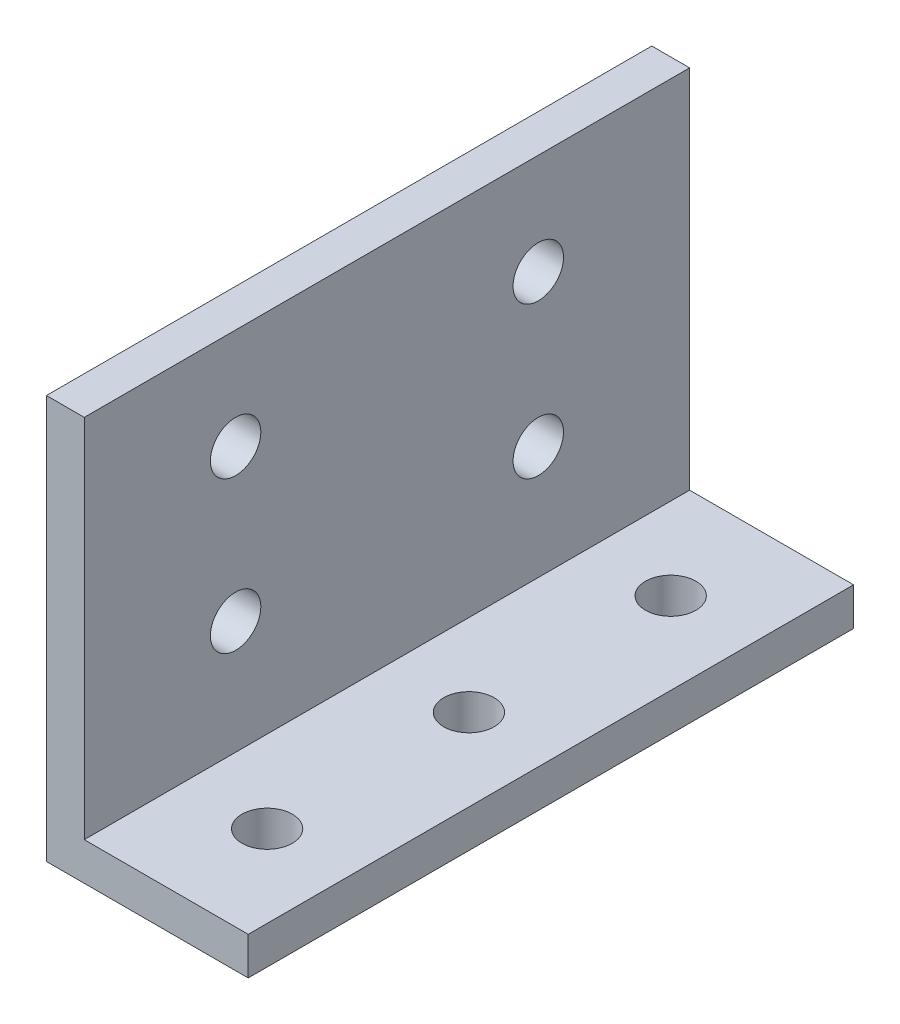
ISO-10303-21;
HEADER;
FILE_DESCRIPTION(('STEP AP214'),'2;1');
FILE_NAME('part.step','',(''),(''),'','','');
FILE_SCHEMA(('AUTOMOTIVE_DESIGN { 1 0 10303 214 1 1 1 1 }'));
ENDSEC;
DATA;
#1=APPLICATION_CONTEXT('core data for automotive mechanical design processes');
#2=APPLICATION_PROTOCOL_DEFINITION('international standard','automotive_design',2000,#1);
#3=PRODUCT_CONTEXT('',#1,'mechanical');
#4=PRODUCT('Part','Part','',(#3));
#5=PRODUCT_RELATED_PRODUCT_CATEGORY('part','',(#4));
#6=PRODUCT_DEFINITION_FORMATION('','',#4);
#7=PRODUCT_DEFINITION_CONTEXT('part definition',#1,'design');
#8=PRODUCT_DEFINITION('design','',#6,#7);
#9=PRODUCT_DEFINITION_SHAPE('','',#8);
#10=(LENGTH_UNIT() NAMED_UNIT(*) SI_UNIT(.MILLI.,.METRE.));
#11=(NAMED_UNIT(*) PLANE_ANGLE_UNIT() SI_UNIT($,.RADIAN.));
#12=(NAMED_UNIT(*) SI_UNIT($,.STERADIAN.) SOLID_ANGLE_UNIT());
#13=UNCERTAINTY_MEASURE_WITH_UNIT(LENGTH_MEASURE(1.E-05),#10,'distance_accuracy_value','');
#14=(GEOMETRIC_REPRESENTATION_CONTEXT(3) GLOBAL_UNCERTAINTY_ASSIGNED_CONTEXT((#13)) GLOBAL_UNIT_ASSIGNED_CONTEXT((#10,
#11,#12)) REPRESENTATION_CONTEXT('',''));
#15=CARTESIAN_POINT('',(0.,0.,0.));
#16=DIRECTION('',(0.,0.,1.));
#17=DIRECTION('',(1.,0.,0.));
#18=AXIS2_PLACEMENT_3D('',#15,#16,#17);
#19=CARTESIAN_POINT('',(0.,0.,76.2));
#20=DIRECTION('',(0.,-1.,0.));
#21=DIRECTION('',(0.,0.,-1.));
#22=AXIS2_PLACEMENT_3D('',#19,#20,#21);
#23=PLANE('',#22);
#24=CARTESIAN_POINT('',(10.31875,0.,38.1));
#25=DIRECTION('',(0.,1.,0.));
#26=DIRECTION('',(0.,0.,1.));
#27=AXIS2_PLACEMENT_3D('',#24,#25,#26);
#28=CIRCLE('',#27,3.175);
#29=CARTESIAN_POINT('',(10.31875,0.,41.275));
#30=VERTEX_POINT('',#29);
#31=EDGE_CURVE('E163',#30,#30,#28,.T.);
#32=ORIENTED_EDGE('',*,*,#31,.F.);
#33=EDGE_LOOP('',(#32));
#34=FACE_BOUND('',#33,.T.);
#35=CARTESIAN_POINT('',(10.31875,0.,63.5));
#36=DIRECTION('',(0.,1.,0.));
#37=DIRECTION('',(0.,0.,1.));
#38=AXIS2_PLACEMENT_3D('',#35,#36,#37);
#39=CIRCLE('',#38,3.175);
#40=CARTESIAN_POINT('',(10.31875,0.,66.675));
#41=VERTEX_POINT('',#40);
#42=EDGE_CURVE('E167',#41,#41,#39,.T.);
#43=ORIENTED_EDGE('',*,*,#42,.F.);
#44=EDGE_LOOP('',(#43));
#45=FACE_BOUND('',#44,.T.);
#46=CARTESIAN_POINT('',(10.31875,0.,12.7));
#47=DIRECTION('',(0.,1.,0.));
#48=DIRECTION('',(0.,0.,1.));
#49=AXIS2_PLACEMENT_3D('',#46,#47,#48);
#50=CIRCLE('',#49,3.175);
#51=CARTESIAN_POINT('',(10.31875,0.,15.875));
#52=VERTEX_POINT('',#51);
#53=EDGE_CURVE('E170',#52,#52,#50,.T.);
#54=ORIENTED_EDGE('',*,*,#53,.F.);
#55=EDGE_LOOP('',(#54));
#56=FACE_BOUND('',#55,.T.);
#57=DIRECTION('',(-1.,0.,0.));
#58=VECTOR('',#57,1.);
#59=CARTESIAN_POINT('',(0.,0.,0.));
#60=LINE('',#59,#58);
#61=CARTESIAN_POINT('',(20.6375,0.,0.));
#62=VERTEX_POINT('',#61);
#63=CARTESIAN_POINT('',(0.,0.,0.));
#64=VERTEX_POINT('',#63);
#65=EDGE_CURVE('E118',#62,#64,#60,.T.);
#66=ORIENTED_EDGE('',*,*,#65,.T.);
#67=DIRECTION('',(0.,0.,-1.));
#68=VECTOR('',#67,1.);
#69=CARTESIAN_POINT('',(0.,0.,76.2));
#70=LINE('',#69,#68);
#71=CARTESIAN_POINT('',(0.,0.,76.2));
#72=VERTEX_POINT('',#71);
#73=EDGE_CURVE('E11',#72,#64,#70,.T.);
#74=ORIENTED_EDGE('',*,*,#73,.F.);
#75=DIRECTION('',(-1.,0.,0.));
#76=VECTOR('',#75,1.);
#77=CARTESIAN_POINT('',(0.,0.,76.2));
#78=LINE('',#77,#76);
#79=CARTESIAN_POINT('',(20.6375,0.,76.2));
#80=VERTEX_POINT('',#79);
#81=EDGE_CURVE('E129',#80,#72,#78,.T.);
#82=ORIENTED_EDGE('',*,*,#81,.F.);
#83=DIRECTION('',(0.,0.,-1.));
#84=VECTOR('',#83,1.);
#85=CARTESIAN_POINT('',(20.6375,0.,76.2));
#86=LINE('',#85,#84);
#87=EDGE_CURVE('E114',#80,#62,#86,.T.);
#88=ORIENTED_EDGE('',*,*,#87,.T.);
#89=EDGE_LOOP('',(#66,#74,#82,#88));
#90=FACE_BOUND('',#89,.T.);
#91=ADVANCED_FACE('F34',(#34,#45,#56,#90),#23,.F.);
#92=CARTESIAN_POINT('',(0.,0.,76.2));
#93=DIRECTION('',(-1.,0.,0.));
#94=DIRECTION('',(0.,0.,1.));
#95=AXIS2_PLACEMENT_3D('',#92,#93,#94);
#96=PLANE('',#95);
#97=CARTESIAN_POINT('',(0.,14.2875,57.1499999999995));
#98=DIRECTION('',(1.,0.,0.));
#99=DIRECTION('',(0.,0.,-1.));
#100=AXIS2_PLACEMENT_3D('',#97,#98,#99);
#101=CIRCLE('',#100,3.175);
#102=CARTESIAN_POINT('',(0.,14.2875,53.9749999999995));
#103=VERTEX_POINT('',#102);
#104=EDGE_CURVE('E176',#103,#103,#101,.T.);
#105=ORIENTED_EDGE('',*,*,#104,.F.);
#106=EDGE_LOOP('',(#105));
#107=FACE_BOUND('',#106,.T.);
#108=CARTESIAN_POINT('',(0.,14.2875,19.049999999999));
#109=DIRECTION('',(1.,0.,0.));
#110=DIRECTION('',(0.,0.,-1.));
#111=AXIS2_PLACEMENT_3D('',#108,#109,#110);
#112=CIRCLE('',#111,3.175);
#113=CARTESIAN_POINT('',(0.,14.2875,15.874999999999));
#114=VERTEX_POINT('',#113);
#115=EDGE_CURVE('E187',#114,#114,#112,.T.);
#116=ORIENTED_EDGE('',*,*,#115,.F.);
#117=EDGE_LOOP('',(#116));
#118=FACE_BOUND('',#117,.T.);
#119=CARTESIAN_POINT('',(0.,33.3375,19.05));
#120=DIRECTION('',(1.,0.,0.));
#121=DIRECTION('',(0.,0.,-1.));
#122=AXIS2_PLACEMENT_3D('',#119,#120,#121);
#123=CIRCLE('',#122,3.175);
#124=CARTESIAN_POINT('',(0.,33.3375,15.875));
#125=VERTEX_POINT('',#124);
#126=EDGE_CURVE('E193',#125,#125,#123,.T.);
#127=ORIENTED_EDGE('',*,*,#126,.F.);
#128=EDGE_LOOP('',(#127));
#129=FACE_BOUND('',#128,.T.);
#130=CARTESIAN_POINT('',(0.,33.3375,57.15));
#131=DIRECTION('',(1.,0.,0.));
#132=DIRECTION('',(0.,0.,-1.));
#133=AXIS2_PLACEMENT_3D('',#130,#131,#132);
#134=CIRCLE('',#133,3.175);
#135=CARTESIAN_POINT('',(0.,33.3375,53.975));
#136=VERTEX_POINT('',#135);
#137=EDGE_CURVE('E199',#136,#136,#134,.T.);
#138=ORIENTED_EDGE('',*,*,#137,.F.);
#139=EDGE_LOOP('',(#138));
#140=FACE_BOUND('',#139,.T.);
#141=DIRECTION('',(0.,1.,0.));
#142=VECTOR('',#141,1.);
#143=CARTESIAN_POINT('',(0.,0.,0.));
#144=LINE('',#143,#142);
#145=CARTESIAN_POINT('',(0.,46.0375,0.));
#146=VERTEX_POINT('',#145);
#147=EDGE_CURVE('E121',#64,#146,#144,.T.);
#148=ORIENTED_EDGE('',*,*,#147,.T.);
#149=DIRECTION('',(0.,0.,-1.));
#150=VECTOR('',#149,1.);
#151=CARTESIAN_POINT('',(0.,46.0375,76.2));
#152=LINE('',#151,#150);
#153=CARTESIAN_POINT('',(0.,46.0375,76.2));
#154=VERTEX_POINT('',#153);
#155=EDGE_CURVE('E42',#154,#146,#152,.T.);
#156=ORIENTED_EDGE('',*,*,#155,.F.);
#157=DIRECTION('',(0.,1.,0.));
#158=VECTOR('',#157,1.);
#159=CARTESIAN_POINT('',(0.,0.,76.2));
#160=LINE('',#159,#158);
#161=EDGE_CURVE('E87',#72,#154,#160,.T.);
#162=ORIENTED_EDGE('',*,*,#161,.F.);
#163=ORIENTED_EDGE('',*,*,#73,.T.);
#164=EDGE_LOOP('',(#148,#156,#162,#163));
#165=FACE_BOUND('',#164,.T.);
#166=ADVANCED_FACE('F154',(#107,#118,#129,#140,#165),#96,.F.);
#167=CARTESIAN_POINT('',(0.,46.0375,76.2));
#168=DIRECTION('',(0.,-1.,0.));
#169=DIRECTION('',(0.,0.,-1.));
#170=AXIS2_PLACEMENT_3D('',#167,#168,#169);
#171=PLANE('',#170);
#172=DIRECTION('',(-1.,0.,0.));
#173=VECTOR('',#172,1.);
#174=CARTESIAN_POINT('',(0.,46.0375,0.));
#175=LINE('',#174,#173);
#176=CARTESIAN_POINT('',(-4.7625,46.0375,0.));
#177=VERTEX_POINT('',#176);
#178=EDGE_CURVE('E124',#146,#177,#175,.T.);
#179=ORIENTED_EDGE('',*,*,#178,.T.);
#180=DIRECTION('',(0.,0.,-1.));
#181=VECTOR('',#180,1.);
#182=CARTESIAN_POINT('',(-4.7625,46.0375,76.2));
#183=LINE('',#182,#181);
#184=CARTESIAN_POINT('',(-4.7625,46.0375,76.2));
#185=VERTEX_POINT('',#184);
#186=EDGE_CURVE('E109',#185,#177,#183,.T.);
#187=ORIENTED_EDGE('',*,*,#186,.F.);
#188=DIRECTION('',(-1.,0.,0.));
#189=VECTOR('',#188,1.);
#190=CARTESIAN_POINT('',(0.,46.0375,76.2));
#191=LINE('',#190,#189);
#192=EDGE_CURVE('E100',#154,#185,#191,.T.);
#193=ORIENTED_EDGE('',*,*,#192,.F.);
#194=ORIENTED_EDGE('',*,*,#155,.T.);
#195=EDGE_LOOP('',(#179,#187,#193,#194));
#196=FACE_BOUND('',#195,.T.);
#197=ADVANCED_FACE('F135',(#196),#171,.F.);
#198=CARTESIAN_POINT('',(-4.7625,-4.7625,76.2));
#199=DIRECTION('',(1.,0.,0.));
#200=DIRECTION('',(0.,0.,-1.));
#201=AXIS2_PLACEMENT_3D('',#198,#199,#200);
#202=PLANE('',#201);
#203=CARTESIAN_POINT('',(-4.7625,14.2875,57.1499999999995));
#204=DIRECTION('',(1.,0.,0.));
#205=DIRECTION('',(0.,0.,-1.));
#206=AXIS2_PLACEMENT_3D('',#203,#204,#205);
#207=CIRCLE('',#206,3.175);
#208=CARTESIAN_POINT('',(-4.7625,14.2875,53.9749999999995));
#209=VERTEX_POINT('',#208);
#210=EDGE_CURVE('E184',#209,#209,#207,.F.);
#211=ORIENTED_EDGE('',*,*,#210,.F.);
#212=EDGE_LOOP('',(#211));
#213=FACE_BOUND('',#212,.T.);
#214=CARTESIAN_POINT('',(-4.7625,14.2875,19.049999999999));
#215=DIRECTION('',(1.,0.,0.));
#216=DIRECTION('',(0.,0.,-1.));
#217=AXIS2_PLACEMENT_3D('',#214,#215,#216);
#218=CIRCLE('',#217,3.175);
#219=CARTESIAN_POINT('',(-4.7625,14.2875,15.874999999999));
#220=VERTEX_POINT('',#219);
#221=EDGE_CURVE('E190',#220,#220,#218,.F.);
#222=ORIENTED_EDGE('',*,*,#221,.F.);
#223=EDGE_LOOP('',(#222));
#224=FACE_BOUND('',#223,.T.);
#225=CARTESIAN_POINT('',(-4.7625,33.3375,19.05));
#226=DIRECTION('',(1.,0.,0.));
#227=DIRECTION('',(0.,0.,-1.));
#228=AXIS2_PLACEMENT_3D('',#225,#226,#227);
#229=CIRCLE('',#228,3.175);
#230=CARTESIAN_POINT('',(-4.7625,33.3375,15.875));
#231=VERTEX_POINT('',#230);
#232=EDGE_CURVE('E196',#231,#231,#229,.F.);
#233=ORIENTED_EDGE('',*,*,#232,.F.);
#234=EDGE_LOOP('',(#233));
#235=FACE_BOUND('',#234,.T.);
#236=CARTESIAN_POINT('',(-4.7625,33.3375,57.15));
#237=DIRECTION('',(1.,0.,0.));
#238=DIRECTION('',(0.,0.,-1.));
#239=AXIS2_PLACEMENT_3D('',#236,#237,#238);
#240=CIRCLE('',#239,3.175);
#241=CARTESIAN_POINT('',(-4.7625,33.3375,53.975));
#242=VERTEX_POINT('',#241);
#243=EDGE_CURVE('E122',#242,#242,#240,.F.);
#244=ORIENTED_EDGE('',*,*,#243,.F.);
#245=EDGE_LOOP('',(#244));
#246=FACE_BOUND('',#245,.T.);
#247=DIRECTION('',(0.,-1.,0.));
#248=VECTOR('',#247,1.);
#249=CARTESIAN_POINT('',(-4.7625,-4.7625,0.));
#250=LINE('',#249,#248);
#251=CARTESIAN_POINT('',(-4.7625,-4.7625,0.));
#252=VERTEX_POINT('',#251);
#253=EDGE_CURVE('E108',#177,#252,#250,.T.);
#254=ORIENTED_EDGE('',*,*,#253,.T.);
#255=DIRECTION('',(0.,0.,-1.));
#256=VECTOR('',#255,1.);
#257=CARTESIAN_POINT('',(-4.7625,-4.7625,76.2));
#258=LINE('',#257,#256);
#259=CARTESIAN_POINT('',(-4.7625,-4.7625,76.2));
#260=VERTEX_POINT('',#259);
#261=EDGE_CURVE('E105',#260,#252,#258,.T.);
#262=ORIENTED_EDGE('',*,*,#261,.F.);
#263=DIRECTION('',(0.,-1.,0.));
#264=VECTOR('',#263,1.);
#265=CARTESIAN_POINT('',(-4.7625,-4.7625,76.2));
#266=LINE('',#265,#264);
#267=EDGE_CURVE('E94',#185,#260,#266,.T.);
#268=ORIENTED_EDGE('',*,*,#267,.F.);
#269=ORIENTED_EDGE('',*,*,#186,.T.);
#270=EDGE_LOOP('',(#254,#262,#268,#269));
#271=FACE_BOUND('',#270,.T.);
#272=ADVANCED_FACE('F106',(#213,#224,#235,#246,#271),#202,.F.);
#273=CARTESIAN_POINT('',(-4.7625,-4.7625,76.2));
#274=DIRECTION('',(0.,1.,0.));
#275=DIRECTION('',(0.,0.,1.));
#276=AXIS2_PLACEMENT_3D('',#273,#274,#275);
#277=PLANE('',#276);
#278=CARTESIAN_POINT('',(10.31875,-4.7625,38.1));
#279=DIRECTION('',(0.,1.,0.));
#280=DIRECTION('',(0.,0.,1.));
#281=AXIS2_PLACEMENT_3D('',#278,#279,#280);
#282=CIRCLE('',#281,3.175);
#283=CARTESIAN_POINT('',(10.31875,-4.7625,41.275));
#284=VERTEX_POINT('',#283);
#285=EDGE_CURVE('E315',#284,#284,#282,.F.);
#286=ORIENTED_EDGE('',*,*,#285,.F.);
#287=EDGE_LOOP('',(#286));
#288=FACE_BOUND('',#287,.T.);
#289=CARTESIAN_POINT('',(10.31875,-4.7625,63.5));
#290=DIRECTION('',(0.,1.,0.));
#291=DIRECTION('',(0.,0.,1.));
#292=AXIS2_PLACEMENT_3D('',#289,#290,#291);
#293=CIRCLE('',#292,3.175);
#294=CARTESIAN_POINT('',(10.31875,-4.7625,66.675));
#295=VERTEX_POINT('',#294);
#296=EDGE_CURVE('E173',#295,#295,#293,.F.);
#297=ORIENTED_EDGE('',*,*,#296,.F.);
#298=EDGE_LOOP('',(#297));
#299=FACE_BOUND('',#298,.T.);
#300=CARTESIAN_POINT('',(10.31875,-4.7625,12.7));
#301=DIRECTION('',(0.,1.,0.));
#302=DIRECTION('',(0.,0.,1.));
#303=AXIS2_PLACEMENT_3D('',#300,#301,#302);
#304=CIRCLE('',#303,3.175);
#305=CARTESIAN_POINT('',(10.31875,-4.7625,15.875));
#306=VERTEX_POINT('',#305);
#307=EDGE_CURVE('E172',#306,#306,#304,.F.);
#308=ORIENTED_EDGE('',*,*,#307,.F.);
#309=EDGE_LOOP('',(#308));
#310=FACE_BOUND('',#309,.T.);
#311=DIRECTION('',(1.,0.,0.));
#312=VECTOR('',#311,1.);
#313=CARTESIAN_POINT('',(-4.7625,-4.7625,0.));
#314=LINE('',#313,#312);
#315=CARTESIAN_POINT('',(20.6375,-4.7625,0.));
#316=VERTEX_POINT('',#315);
#317=EDGE_CURVE('E73',#252,#316,#314,.T.);
#318=ORIENTED_EDGE('',*,*,#317,.T.);
#319=DIRECTION('',(0.,0.,-1.));
#320=VECTOR('',#319,1.);
#321=CARTESIAN_POINT('',(20.6375,-4.7625,76.2));
#322=LINE('',#321,#320);
#323=CARTESIAN_POINT('',(20.6375,-4.7625,76.2));
#324=VERTEX_POINT('',#323);
#325=EDGE_CURVE('E110',#324,#316,#322,.T.);
#326=ORIENTED_EDGE('',*,*,#325,.F.);
#327=DIRECTION('',(1.,0.,0.));
#328=VECTOR('',#327,1.);
#329=CARTESIAN_POINT('',(-4.7625,-4.7625,76.2));
#330=LINE('',#329,#328);
#331=EDGE_CURVE('E98',#260,#324,#330,.T.);
#332=ORIENTED_EDGE('',*,*,#331,.F.);
#333=ORIENTED_EDGE('',*,*,#261,.T.);
#334=EDGE_LOOP('',(#318,#326,#332,#333));
#335=FACE_BOUND('',#334,.T.);
#336=ADVANCED_FACE('F112',(#288,#299,#310,#335),#277,.F.);
#337=CARTESIAN_POINT('',(20.6375,0.,76.2));
#338=DIRECTION('',(-1.,0.,0.));
#339=DIRECTION('',(0.,0.,1.));
#340=AXIS2_PLACEMENT_3D('',#337,#338,#339);
#341=PLANE('',#340);
#342=DIRECTION('',(0.,1.,0.));
#343=VECTOR('',#342,1.);
#344=CARTESIAN_POINT('',(20.6375,0.,0.));
#345=LINE('',#344,#343);
#346=EDGE_CURVE('E79',#316,#62,#345,.T.);
#347=ORIENTED_EDGE('',*,*,#346,.T.);
#348=ORIENTED_EDGE('',*,*,#87,.F.);
#349=DIRECTION('',(0.,1.,0.));
#350=VECTOR('',#349,1.);
#351=CARTESIAN_POINT('',(20.6375,0.,76.2));
#352=LINE('',#351,#350);
#353=EDGE_CURVE('E50',#324,#80,#352,.T.);
#354=ORIENTED_EDGE('',*,*,#353,.F.);
#355=ORIENTED_EDGE('',*,*,#325,.T.);
#356=EDGE_LOOP('',(#347,#348,#354,#355));
#357=FACE_BOUND('',#356,.T.);
#358=ADVANCED_FACE('F142',(#357),#341,.F.);
#359=CARTESIAN_POINT('',(0.,0.,76.2));
#360=DIRECTION('',(0.,0.,-1.));
#361=DIRECTION('',(-1.,0.,0.));
#362=AXIS2_PLACEMENT_3D('',#359,#360,#361);
#363=PLANE('',#362);
#364=ORIENTED_EDGE('',*,*,#81,.T.);
#365=ORIENTED_EDGE('',*,*,#161,.T.);
#366=ORIENTED_EDGE('',*,*,#192,.T.);
#367=ORIENTED_EDGE('',*,*,#267,.T.);
#368=ORIENTED_EDGE('',*,*,#331,.T.);
#369=ORIENTED_EDGE('',*,*,#353,.T.);
#370=EDGE_LOOP('',(#364,#365,#366,#367,#368,#369));
#371=FACE_BOUND('',#370,.T.);
#372=ADVANCED_FACE('F96',(#371),#363,.F.);
#373=CARTESIAN_POINT('',(0.,0.,0.));
#374=DIRECTION('',(0.,0.,-1.));
#375=DIRECTION('',(-1.,0.,0.));
#376=AXIS2_PLACEMENT_3D('',#373,#374,#375);
#377=PLANE('',#376);
#378=ORIENTED_EDGE('',*,*,#65,.F.);
#379=ORIENTED_EDGE('',*,*,#346,.F.);
#380=ORIENTED_EDGE('',*,*,#317,.F.);
#381=ORIENTED_EDGE('',*,*,#253,.F.);
#382=ORIENTED_EDGE('',*,*,#178,.F.);
#383=ORIENTED_EDGE('',*,*,#147,.F.);
#384=EDGE_LOOP('',(#378,#379,#380,#381,#382,#383));
#385=FACE_BOUND('',#384,.T.);
#386=ADVANCED_FACE('F138',(#385),#377,.T.);
#387=CARTESIAN_POINT('',(-4.7635,33.3375,57.15));
#388=DIRECTION('',(1.,0.,0.));
#389=DIRECTION('',(0.,0.,-1.));
#390=AXIS2_PLACEMENT_3D('',#387,#388,#389);
#391=CYLINDRICAL_SURFACE('',#390,3.175);
#392=ORIENTED_EDGE('',*,*,#137,.T.);
#393=EDGE_LOOP('',(#392));
#394=FACE_BOUND('',#393,.T.);
#395=ORIENTED_EDGE('',*,*,#243,.T.);
#396=EDGE_LOOP('',(#395));
#397=FACE_BOUND('',#396,.T.);
#398=ADVANCED_FACE('F207',(#394,#397),#391,.F.);
#399=CARTESIAN_POINT('',(-4.7635,33.3375,19.05));
#400=DIRECTION('',(1.,0.,0.));
#401=DIRECTION('',(0.,0.,-1.));
#402=AXIS2_PLACEMENT_3D('',#399,#400,#401);
#403=CYLINDRICAL_SURFACE('',#402,3.175);
#404=ORIENTED_EDGE('',*,*,#126,.T.);
#405=EDGE_LOOP('',(#404));
#406=FACE_BOUND('',#405,.T.);
#407=ORIENTED_EDGE('',*,*,#232,.T.);
#408=EDGE_LOOP('',(#407));
#409=FACE_BOUND('',#408,.T.);
#410=ADVANCED_FACE('F222',(#406,#409),#403,.F.);
#411=CARTESIAN_POINT('',(-4.7635,14.2875,19.049999999999));
#412=DIRECTION('',(1.,0.,0.));
#413=DIRECTION('',(0.,0.,-1.));
#414=AXIS2_PLACEMENT_3D('',#411,#412,#413);
#415=CYLINDRICAL_SURFACE('',#414,3.175);
#416=ORIENTED_EDGE('',*,*,#115,.T.);
#417=EDGE_LOOP('',(#416));
#418=FACE_BOUND('',#417,.T.);
#419=ORIENTED_EDGE('',*,*,#221,.T.);
#420=EDGE_LOOP('',(#419));
#421=FACE_BOUND('',#420,.T.);
#422=ADVANCED_FACE('F224',(#418,#421),#415,.F.);
#423=CARTESIAN_POINT('',(-4.7635,14.2875,57.1499999999995));
#424=DIRECTION('',(1.,0.,0.));
#425=DIRECTION('',(0.,0.,-1.));
#426=AXIS2_PLACEMENT_3D('',#423,#424,#425);
#427=CYLINDRICAL_SURFACE('',#426,3.175);
#428=ORIENTED_EDGE('',*,*,#104,.T.);
#429=EDGE_LOOP('',(#428));
#430=FACE_BOUND('',#429,.T.);
#431=ORIENTED_EDGE('',*,*,#210,.T.);
#432=EDGE_LOOP('',(#431));
#433=FACE_BOUND('',#432,.T.);
#434=ADVANCED_FACE('F231',(#430,#433),#427,.F.);
#435=CARTESIAN_POINT('',(10.31875,-4.7635,12.7));
#436=DIRECTION('',(0.,1.,0.));
#437=DIRECTION('',(0.,0.,1.));
#438=AXIS2_PLACEMENT_3D('',#435,#436,#437);
#439=CYLINDRICAL_SURFACE('',#438,3.175);
#440=ORIENTED_EDGE('',*,*,#53,.T.);
#441=EDGE_LOOP('',(#440));
#442=FACE_BOUND('',#441,.T.);
#443=ORIENTED_EDGE('',*,*,#307,.T.);
#444=EDGE_LOOP('',(#443));
#445=FACE_BOUND('',#444,.T.);
#446=ADVANCED_FACE('F267',(#442,#445),#439,.F.);
#447=CARTESIAN_POINT('',(10.31875,-4.7635,63.5));
#448=DIRECTION('',(0.,1.,0.));
#449=DIRECTION('',(0.,0.,1.));
#450=AXIS2_PLACEMENT_3D('',#447,#448,#449);
#451=CYLINDRICAL_SURFACE('',#450,3.175);
#452=ORIENTED_EDGE('',*,*,#42,.T.);
#453=EDGE_LOOP('',(#452));
#454=FACE_BOUND('',#453,.T.);
#455=ORIENTED_EDGE('',*,*,#296,.T.);
#456=EDGE_LOOP('',(#455));
#457=FACE_BOUND('',#456,.T.);
#458=ADVANCED_FACE('F289',(#454,#457),#451,.F.);
#459=CARTESIAN_POINT('',(10.31875,-4.7635,38.1));
#460=DIRECTION('',(0.,1.,0.));
#461=DIRECTION('',(0.,0.,1.));
#462=AXIS2_PLACEMENT_3D('',#459,#460,#461);
#463=CYLINDRICAL_SURFACE('',#462,3.175);
#464=ORIENTED_EDGE('',*,*,#31,.T.);
#465=EDGE_LOOP('',(#464));
#466=FACE_BOUND('',#465,.T.);
#467=ORIENTED_EDGE('',*,*,#285,.T.);
#468=EDGE_LOOP('',(#467));
#469=FACE_BOUND('',#468,.T.);
#470=ADVANCED_FACE('F298',(#466,#469),#463,.F.);
#471=CLOSED_SHELL('',(#91,#166,#197,#272,#336,#358,#372,#386,#398,#410,#422,#434,#446,#458,#470));
#472=MANIFOLD_SOLID_BREP('B2',#471);
#473=ADVANCED_BREP_SHAPE_REPRESENTATION('',(#18,#472),#14);
#474=SHAPE_DEFINITION_REPRESENTATION(#9,#473);
ENDSEC;
END-ISO-10303-21;
